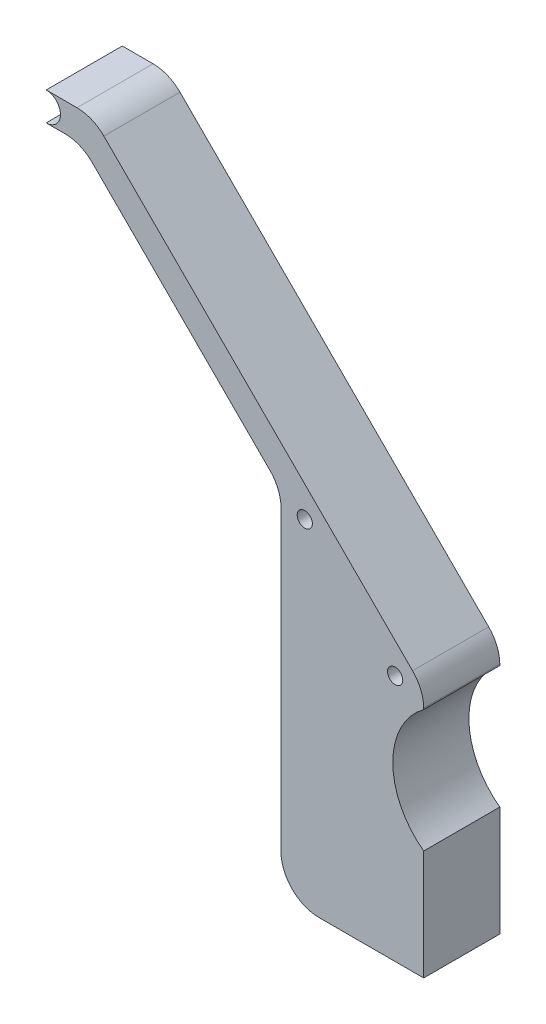
ISO-10303-21;
HEADER;
FILE_DESCRIPTION(('STEP AP214'),'2;1');
FILE_NAME('part.step','',(''),(''),'','','');
FILE_SCHEMA(('AUTOMOTIVE_DESIGN { 1 0 10303 214 1 1 1 1 }'));
ENDSEC;
DATA;
#1=APPLICATION_CONTEXT('core data for automotive mechanical design processes');
#2=APPLICATION_PROTOCOL_DEFINITION('international standard','automotive_design',2000,#1);
#3=PRODUCT_CONTEXT('',#1,'mechanical');
#4=PRODUCT('Part','Part','',(#3));
#5=PRODUCT_RELATED_PRODUCT_CATEGORY('part','',(#4));
#6=PRODUCT_DEFINITION_FORMATION('','',#4);
#7=PRODUCT_DEFINITION_CONTEXT('part definition',#1,'design');
#8=PRODUCT_DEFINITION('design','',#6,#7);
#9=PRODUCT_DEFINITION_SHAPE('','',#8);
#10=(LENGTH_UNIT() NAMED_UNIT(*) SI_UNIT(.MILLI.,.METRE.));
#11=(NAMED_UNIT(*) PLANE_ANGLE_UNIT() SI_UNIT($,.RADIAN.));
#12=(NAMED_UNIT(*) SI_UNIT($,.STERADIAN.) SOLID_ANGLE_UNIT());
#13=UNCERTAINTY_MEASURE_WITH_UNIT(LENGTH_MEASURE(1.E-05),#10,'distance_accuracy_value','');
#14=(GEOMETRIC_REPRESENTATION_CONTEXT(3) GLOBAL_UNCERTAINTY_ASSIGNED_CONTEXT((#13)) GLOBAL_UNIT_ASSIGNED_CONTEXT((#10,
#11,#12)) REPRESENTATION_CONTEXT('',''));
#15=CARTESIAN_POINT('',(0.,0.,0.));
#16=DIRECTION('',(0.,0.,1.));
#17=DIRECTION('',(1.,0.,0.));
#18=AXIS2_PLACEMENT_3D('',#15,#16,#17);
#19=CARTESIAN_POINT('',(0.0303342495161785,8.21230643760333,-8.));
#20=DIRECTION('',(1.,0.,0.));
#21=DIRECTION('',(0.,0.,-1.));
#22=AXIS2_PLACEMENT_3D('',#19,#20,#21);
#23=PLANE('',#22);
#24=DIRECTION('',(0.,0.,1.));
#25=VECTOR('',#24,1.);
#26=CARTESIAN_POINT('',(0.0303342495161819,6.43719659479187,-8.));
#27=LINE('',#26,#25);
#28=CARTESIAN_POINT('',(0.0303342495161819,6.43719659479187,-8.));
#29=VERTEX_POINT('',#28);
#30=CARTESIAN_POINT('',(0.0303342495161785,6.43719659479187,0.));
#31=VERTEX_POINT('',#30);
#32=EDGE_CURVE('E56',#29,#31,#27,.T.);
#33=ORIENTED_EDGE('',*,*,#32,.F.);
#34=DIRECTION('',(0.,1.,0.));
#35=VECTOR('',#34,1.);
#36=CARTESIAN_POINT('',(0.0303342495161785,8.21230643760333,-8.));
#37=LINE('',#36,#35);
#38=CARTESIAN_POINT('',(0.0303342495161785,6.55545218811096,-8.));
#39=VERTEX_POINT('',#38);
#40=EDGE_CURVE('E166',#29,#39,#37,.T.);
#41=ORIENTED_EDGE('',*,*,#40,.T.);
#42=DIRECTION('',(0.,0.,1.));
#43=VECTOR('',#42,1.);
#44=CARTESIAN_POINT('',(0.0303342495161785,6.55545218811096,-8.));
#45=LINE('',#44,#43);
#46=CARTESIAN_POINT('',(0.0303342495161785,6.55545218811096,0.));
#47=VERTEX_POINT('',#46);
#48=EDGE_CURVE('E262',#39,#47,#45,.T.);
#49=ORIENTED_EDGE('',*,*,#48,.T.);
#50=DIRECTION('',(0.,1.,0.));
#51=VECTOR('',#50,1.);
#52=CARTESIAN_POINT('',(0.0303342495161785,8.21230643760333,0.));
#53=LINE('',#52,#51);
#54=EDGE_CURVE('E207',#31,#47,#53,.T.);
#55=ORIENTED_EDGE('',*,*,#54,.F.);
#56=EDGE_LOOP('',(#33,#41,#49,#55));
#57=FACE_BOUND('',#56,.T.);
#58=ADVANCED_FACE('F40',(#57),#23,.T.);
#59=DIRECTION('',(0.,0.,1.));
#60=VECTOR('',#59,1.);
#61=CARTESIAN_POINT('',(0.0303342495161819,-6.43719659479187,-8.));
#62=LINE('',#61,#60);
#63=CARTESIAN_POINT('',(0.0303342495161819,-6.43719659479187,-8.));
#64=VERTEX_POINT('',#63);
#65=CARTESIAN_POINT('',(0.0303342495161819,-6.43719659479187,0.));
#66=VERTEX_POINT('',#65);
#67=EDGE_CURVE('E147',#64,#66,#62,.T.);
#68=ORIENTED_EDGE('',*,*,#67,.T.);
#69=CARTESIAN_POINT('',(0.0303342495161819,-18.0000000000001,0.));
#70=VERTEX_POINT('',#69);
#71=EDGE_CURVE('E203',#70,#66,#53,.T.);
#72=ORIENTED_EDGE('',*,*,#71,.F.);
#73=DIRECTION('',(0.,0.,1.));
#74=VECTOR('',#73,1.);
#75=CARTESIAN_POINT('',(0.0303342495161819,-18.0000000000001,-35.459060435492));
#76=LINE('',#75,#74);
#77=CARTESIAN_POINT('',(0.0303342495161819,-18.0000000000001,-8.));
#78=VERTEX_POINT('',#77);
#79=EDGE_CURVE('E171',#78,#70,#76,.T.);
#80=ORIENTED_EDGE('',*,*,#79,.F.);
#81=EDGE_CURVE('E163',#78,#64,#37,.T.);
#82=ORIENTED_EDGE('',*,*,#81,.T.);
#83=EDGE_LOOP('',(#68,#72,#80,#82));
#84=FACE_BOUND('',#83,.T.);
#85=ADVANCED_FACE('F169',(#84),#23,.T.);
#86=CARTESIAN_POINT('',(-14.9696657504838,4.99999999999992,-8.));
#87=DIRECTION('',(-1.,0.,0.));
#88=DIRECTION('',(0.,-1.,0.));
#89=AXIS2_PLACEMENT_3D('',#86,#87,#88);
#90=PLANE('',#89);
#91=DIRECTION('',(0.,-1.,0.));
#92=VECTOR('',#91,1.);
#93=CARTESIAN_POINT('',(-14.9696657504838,4.99999999999992,-8.));
#94=LINE('',#93,#92);
#95=CARTESIAN_POINT('',(-14.9696657504838,17.3128115009916,-8.));
#96=VERTEX_POINT('',#95);
#97=CARTESIAN_POINT('',(-14.9696657504838,-14.0000000000001,-8.));
#98=VERTEX_POINT('',#97);
#99=EDGE_CURVE('E198',#96,#98,#94,.T.);
#100=ORIENTED_EDGE('',*,*,#99,.T.);
#101=DIRECTION('',(0.,0.,1.));
#102=VECTOR('',#101,1.);
#103=CARTESIAN_POINT('',(-14.9696657504838,-14.0000000000001,-8.));
#104=LINE('',#103,#102);
#105=CARTESIAN_POINT('',(-14.9696657504838,-14.0000000000001,0.));
#106=VERTEX_POINT('',#105);
#107=EDGE_CURVE('E238',#98,#106,#104,.T.);
#108=ORIENTED_EDGE('',*,*,#107,.T.);
#109=DIRECTION('',(0.,-1.,0.));
#110=VECTOR('',#109,1.);
#111=CARTESIAN_POINT('',(-14.9696657504838,4.99999999999992,0.));
#112=LINE('',#111,#110);
#113=CARTESIAN_POINT('',(-14.9696657504838,17.3128115009916,0.));
#114=VERTEX_POINT('',#113);
#115=EDGE_CURVE('E179',#114,#106,#112,.T.);
#116=ORIENTED_EDGE('',*,*,#115,.F.);
#117=DIRECTION('',(0.,0.,1.));
#118=VECTOR('',#117,1.);
#119=CARTESIAN_POINT('',(-14.9696657504838,17.3128115009916,-8.));
#120=LINE('',#119,#118);
#121=EDGE_CURVE('E232',#114,#96,#120,.F.);
#122=ORIENTED_EDGE('',*,*,#121,.T.);
#123=EDGE_LOOP('',(#100,#108,#116,#122));
#124=FACE_BOUND('',#123,.T.);
#125=ADVANCED_FACE('F301',(#124),#90,.T.);
#126=CARTESIAN_POINT('',(-14.9696657504838,18.969665750484,-8.));
#127=DIRECTION('',(-0.707106781186546,-0.707106781186549,0.));
#128=DIRECTION('',(0.707106781186549,-0.707106781186546,0.));
#129=AXIS2_PLACEMENT_3D('',#126,#127,#128);
#130=PLANE('',#129);
#131=DIRECTION('',(0.707106781186549,-0.707106781186546,0.));
#132=VECTOR('',#131,1.);
#133=CARTESIAN_POINT('',(-14.9696657504838,18.969665750484,0.));
#134=LINE('',#133,#132);
#135=CARTESIAN_POINT('',(-34.8284271247461,38.8284271247461,0.));
#136=VERTEX_POINT('',#135);
#137=CARTESIAN_POINT('',(-16.1412386257376,20.1412386257378,0.));
#138=VERTEX_POINT('',#137);
#139=EDGE_CURVE('E222',#136,#138,#134,.T.);
#140=ORIENTED_EDGE('',*,*,#139,.F.);
#141=DIRECTION('',(0.,0.,1.));
#142=VECTOR('',#141,1.);
#143=CARTESIAN_POINT('',(-34.828427124746,38.8284271247461,-8.));
#144=LINE('',#143,#142);
#145=CARTESIAN_POINT('',(-34.8284271247461,38.8284271247461,-8.));
#146=VERTEX_POINT('',#145);
#147=EDGE_CURVE('E281',#136,#146,#144,.F.);
#148=ORIENTED_EDGE('',*,*,#147,.T.);
#149=DIRECTION('',(0.707106781186549,-0.707106781186546,0.));
#150=VECTOR('',#149,1.);
#151=CARTESIAN_POINT('',(-14.9696657504838,18.969665750484,-8.));
#152=LINE('',#151,#150);
#153=CARTESIAN_POINT('',(-16.1412386257376,20.1412386257378,-8.));
#154=VERTEX_POINT('',#153);
#155=EDGE_CURVE('E194',#146,#154,#152,.T.);
#156=ORIENTED_EDGE('',*,*,#155,.T.);
#157=DIRECTION('',(0.,0.,1.));
#158=VECTOR('',#157,1.);
#159=CARTESIAN_POINT('',(-16.1412386257376,20.1412386257378,0.));
#160=LINE('',#159,#158);
#161=EDGE_CURVE('E277',#154,#138,#160,.T.);
#162=ORIENTED_EDGE('',*,*,#161,.T.);
#163=EDGE_LOOP('',(#140,#148,#156,#162));
#164=FACE_BOUND('',#163,.T.);
#165=ADVANCED_FACE('F309',(#164),#130,.T.);
#166=CARTESIAN_POINT('',(-35.9999999999999,39.9999999999999,-8.));
#167=DIRECTION('',(0.,-1.,0.));
#168=DIRECTION('',(0.,0.,-1.));
#169=AXIS2_PLACEMENT_3D('',#166,#167,#168);
#170=PLANE('',#169);
#171=DIRECTION('',(1.,0.,0.));
#172=VECTOR('',#171,1.);
#173=CARTESIAN_POINT('',(-35.9999999999999,39.9999999999999,-8.));
#174=LINE('',#173,#172);
#175=CARTESIAN_POINT('',(-39.649665750484,39.9999999999999,-8.));
#176=VERTEX_POINT('',#175);
#177=CARTESIAN_POINT('',(-37.6568542494922,39.9999999999999,-8.));
#178=VERTEX_POINT('',#177);
#179=EDGE_CURVE('E190',#176,#178,#174,.T.);
#180=ORIENTED_EDGE('',*,*,#179,.T.);
#181=DIRECTION('',(0.,0.,1.));
#182=VECTOR('',#181,1.);
#183=CARTESIAN_POINT('',(-37.6568542494922,39.9999999999999,0.));
#184=LINE('',#183,#182);
#185=CARTESIAN_POINT('',(-37.6568542494922,39.9999999999999,0.));
#186=VERTEX_POINT('',#185);
#187=EDGE_CURVE('E273',#178,#186,#184,.T.);
#188=ORIENTED_EDGE('',*,*,#187,.T.);
#189=DIRECTION('',(1.,0.,0.));
#190=VECTOR('',#189,1.);
#191=CARTESIAN_POINT('',(-35.9999999999999,39.9999999999999,0.));
#192=LINE('',#191,#190);
#193=CARTESIAN_POINT('',(-39.649665750484,39.9999999999999,0.));
#194=VERTEX_POINT('',#193);
#195=EDGE_CURVE('E218',#194,#186,#192,.T.);
#196=ORIENTED_EDGE('',*,*,#195,.F.);
#197=DIRECTION('',(0.,0.,1.));
#198=VECTOR('',#197,1.);
#199=CARTESIAN_POINT('',(-39.649665750484,39.9999999999999,-8.));
#200=LINE('',#199,#198);
#201=EDGE_CURVE('E229',#176,#194,#200,.T.);
#202=ORIENTED_EDGE('',*,*,#201,.F.);
#203=EDGE_LOOP('',(#180,#188,#196,#202));
#204=FACE_BOUND('',#203,.T.);
#205=ADVANCED_FACE('F317',(#204),#170,.T.);
#206=CARTESIAN_POINT('',(-39.649665750484,41.5,-8.));
#207=DIRECTION('',(0.,0.,1.));
#208=DIRECTION('',(1.,0.,0.));
#209=AXIS2_PLACEMENT_3D('',#206,#207,#208);
#210=CYLINDRICAL_SURFACE('',#209,1.50000000000007);
#211=CARTESIAN_POINT('',(-39.649665750484,41.5,0.));
#212=DIRECTION('',(0.,0.,-1.));
#213=DIRECTION('',(-1.,0.,0.));
#214=AXIS2_PLACEMENT_3D('',#211,#212,#213);
#215=CIRCLE('',#214,1.50000000000007);
#216=CARTESIAN_POINT('',(-39.649665750484,43.0000000000001,0.));
#217=VERTEX_POINT('',#216);
#218=EDGE_CURVE('E214',#217,#194,#215,.T.);
#219=ORIENTED_EDGE('',*,*,#218,.F.);
#220=DIRECTION('',(0.,0.,1.));
#221=VECTOR('',#220,1.);
#222=CARTESIAN_POINT('',(-39.649665750484,43.0000000000001,-8.));
#223=LINE('',#222,#221);
#224=CARTESIAN_POINT('',(-39.649665750484,43.0000000000001,-8.));
#225=VERTEX_POINT('',#224);
#226=EDGE_CURVE('E202',#225,#217,#223,.T.);
#227=ORIENTED_EDGE('',*,*,#226,.F.);
#228=CARTESIAN_POINT('',(-39.649665750484,41.5,-8.));
#229=DIRECTION('',(0.,0.,-1.));
#230=DIRECTION('',(-1.,0.,0.));
#231=AXIS2_PLACEMENT_3D('',#228,#229,#230);
#232=CIRCLE('',#231,1.50000000000007);
#233=EDGE_CURVE('E186',#225,#176,#232,.T.);
#234=ORIENTED_EDGE('',*,*,#233,.T.);
#235=ORIENTED_EDGE('',*,*,#201,.T.);
#236=EDGE_LOOP('',(#219,#227,#234,#235));
#237=FACE_BOUND('',#236,.T.);
#238=ADVANCED_FACE('F321',(#237),#210,.F.);
#239=CARTESIAN_POINT('',(-34.7573593128807,43.0000000000001,-8.));
#240=DIRECTION('',(0.,1.,0.));
#241=DIRECTION('',(0.,0.,1.));
#242=AXIS2_PLACEMENT_3D('',#239,#240,#241);
#243=PLANE('',#242);
#244=DIRECTION('',(-1.,0.,0.));
#245=VECTOR('',#244,1.);
#246=CARTESIAN_POINT('',(-34.7573593128807,43.0000000000001,0.));
#247=LINE('',#246,#245);
#248=CARTESIAN_POINT('',(-36.4142135623731,43.0000000000001,0.));
#249=VERTEX_POINT('',#248);
#250=EDGE_CURVE('E211',#249,#217,#247,.T.);
#251=ORIENTED_EDGE('',*,*,#250,.F.);
#252=DIRECTION('',(0.,0.,1.));
#253=VECTOR('',#252,1.);
#254=CARTESIAN_POINT('',(-36.4142135623731,43.0000000000001,-8.));
#255=LINE('',#254,#253);
#256=CARTESIAN_POINT('',(-36.4142135623731,43.0000000000001,-8.));
#257=VERTEX_POINT('',#256);
#258=EDGE_CURVE('E284',#249,#257,#255,.F.);
#259=ORIENTED_EDGE('',*,*,#258,.T.);
#260=DIRECTION('',(-1.,0.,0.));
#261=VECTOR('',#260,1.);
#262=CARTESIAN_POINT('',(-34.7573593128807,43.0000000000001,-8.));
#263=LINE('',#262,#261);
#264=EDGE_CURVE('E177',#257,#225,#263,.T.);
#265=ORIENTED_EDGE('',*,*,#264,.T.);
#266=ORIENTED_EDGE('',*,*,#226,.T.);
#267=EDGE_LOOP('',(#251,#259,#265,#266));
#268=FACE_BOUND('',#267,.T.);
#269=ADVANCED_FACE('F497',(#268),#243,.T.);
#270=CARTESIAN_POINT('',(-34.7573593128807,43.0000000000001,-8.));
#271=DIRECTION('',(0.707106781186546,0.707106781186549,0.));
#272=DIRECTION('',(-0.707106781186549,0.707106781186546,0.));
#273=AXIS2_PLACEMENT_3D('',#270,#271,#272);
#274=PLANE('',#273);
#275=DIRECTION('',(-0.707106781186549,0.707106781186546,0.));
#276=VECTOR('',#275,1.);
#277=CARTESIAN_POINT('',(-34.7573593128807,43.0000000000001,0.));
#278=LINE('',#277,#276);
#279=CARTESIAN_POINT('',(-1.14123862573765,9.38387931285715,0.));
#280=VERTEX_POINT('',#279);
#281=CARTESIAN_POINT('',(-33.5857864376269,41.8284271247463,0.));
#282=VERTEX_POINT('',#281);
#283=EDGE_CURVE('E206',#280,#282,#278,.T.);
#284=ORIENTED_EDGE('',*,*,#283,.F.);
#285=DIRECTION('',(0.,0.,1.));
#286=VECTOR('',#285,1.);
#287=CARTESIAN_POINT('',(-1.14123862573765,9.38387931285715,-8.));
#288=LINE('',#287,#286);
#289=CARTESIAN_POINT('',(-1.14123862573765,9.38387931285715,-8.));
#290=VERTEX_POINT('',#289);
#291=EDGE_CURVE('E270',#280,#290,#288,.F.);
#292=ORIENTED_EDGE('',*,*,#291,.T.);
#293=DIRECTION('',(-0.707106781186549,0.707106781186546,0.));
#294=VECTOR('',#293,1.);
#295=CARTESIAN_POINT('',(-34.7573593128807,43.0000000000001,-8.));
#296=LINE('',#295,#294);
#297=CARTESIAN_POINT('',(-33.5857864376269,41.8284271247463,-8.));
#298=VERTEX_POINT('',#297);
#299=EDGE_CURVE('E173',#290,#298,#296,.T.);
#300=ORIENTED_EDGE('',*,*,#299,.T.);
#301=DIRECTION('',(0.,0.,1.));
#302=VECTOR('',#301,1.);
#303=CARTESIAN_POINT('',(-33.5857864376269,41.8284271247463,-8.));
#304=LINE('',#303,#302);
#305=EDGE_CURVE('E266',#298,#282,#304,.T.);
#306=ORIENTED_EDGE('',*,*,#305,.T.);
#307=EDGE_LOOP('',(#284,#292,#300,#306));
#308=FACE_BOUND('',#307,.T.);
#309=ADVANCED_FACE('F329',(#308),#274,.T.);
#310=CARTESIAN_POINT('',(-39.649665750484,41.5,-8.));
#311=DIRECTION('',(0.,0.,-1.));
#312=DIRECTION('',(-1.,0.,0.));
#313=AXIS2_PLACEMENT_3D('',#310,#311,#312);
#314=PLANE('',#313);
#315=CARTESIAN_POINT('',(4.78033424951618,0.,-8.));
#316=DIRECTION('',(0.,0.,1.));
#317=DIRECTION('',(1.,0.,0.));
#318=AXIS2_PLACEMENT_3D('',#315,#316,#317);
#319=CIRCLE('',#318,8.);
#320=EDGE_CURVE('E150',#29,#64,#319,.T.);
#321=ORIENTED_EDGE('',*,*,#320,.T.);
#322=ORIENTED_EDGE('',*,*,#81,.F.);
#323=DIRECTION('',(1.,0.,0.));
#324=VECTOR('',#323,1.);
#325=CARTESIAN_POINT('',(-14.9696657504838,-18.0000000000001,-8.));
#326=LINE('',#325,#324);
#327=CARTESIAN_POINT('',(-10.9696657504838,-18.0000000000001,-8.));
#328=VERTEX_POINT('',#327);
#329=EDGE_CURVE('E343',#328,#78,#326,.T.);
#330=ORIENTED_EDGE('',*,*,#329,.F.);
#331=CARTESIAN_POINT('',(-10.9696657504838,-14.0000000000001,-8.));
#332=DIRECTION('',(0.,0.,-1.));
#333=DIRECTION('',(-1.,0.,0.));
#334=AXIS2_PLACEMENT_3D('',#331,#332,#333);
#335=CIRCLE('',#334,4.);
#336=EDGE_CURVE('E259',#328,#98,#335,.T.);
#337=ORIENTED_EDGE('',*,*,#336,.T.);
#338=ORIENTED_EDGE('',*,*,#99,.F.);
#339=CARTESIAN_POINT('',(-18.9696657504838,17.3128115009916,-8.));
#340=DIRECTION('',(0.,0.,-1.));
#341=DIRECTION('',(-1.,0.,0.));
#342=AXIS2_PLACEMENT_3D('',#339,#340,#341);
#343=CIRCLE('',#342,4.);
#344=EDGE_CURVE('E11',#96,#154,#343,.F.);
#345=ORIENTED_EDGE('',*,*,#344,.T.);
#346=ORIENTED_EDGE('',*,*,#155,.F.);
#347=CARTESIAN_POINT('',(-37.6568542494922,35.9999999999999,-8.));
#348=DIRECTION('',(0.,0.,-1.));
#349=DIRECTION('',(-1.,0.,0.));
#350=AXIS2_PLACEMENT_3D('',#347,#348,#349);
#351=CIRCLE('',#350,4.);
#352=EDGE_CURVE('E290',#146,#178,#351,.F.);
#353=ORIENTED_EDGE('',*,*,#352,.T.);
#354=ORIENTED_EDGE('',*,*,#179,.F.);
#355=ORIENTED_EDGE('',*,*,#233,.F.);
#356=ORIENTED_EDGE('',*,*,#264,.F.);
#357=CARTESIAN_POINT('',(-36.4142135623731,39.0000000000001,-8.));
#358=DIRECTION('',(0.,0.,-1.));
#359=DIRECTION('',(-1.,0.,0.));
#360=AXIS2_PLACEMENT_3D('',#357,#358,#359);
#361=CIRCLE('',#360,4.);
#362=EDGE_CURVE('E64',#257,#298,#361,.T.);
#363=ORIENTED_EDGE('',*,*,#362,.T.);
#364=ORIENTED_EDGE('',*,*,#299,.F.);
#365=CARTESIAN_POINT('',(-3.96966575048382,6.55545218811096,-8.));
#366=DIRECTION('',(0.,0.,-1.));
#367=DIRECTION('',(-1.,0.,0.));
#368=AXIS2_PLACEMENT_3D('',#365,#366,#367);
#369=CIRCLE('',#368,4.);
#370=EDGE_CURVE('E256',#290,#39,#369,.T.);
#371=ORIENTED_EDGE('',*,*,#370,.T.);
#372=ORIENTED_EDGE('',*,*,#40,.F.);
#373=EDGE_LOOP('',(#321,#322,#330,#337,#338,#345,#346,#353,#354,#355,#356,#363,#364,#371,#372));
#374=FACE_BOUND('',#373,.T.);
#375=CARTESIAN_POINT('',(-2.96966575048382,7.99999999999992,-8.));
#376=DIRECTION('',(0.,0.,1.));
#377=DIRECTION('',(1.,0.,0.));
#378=AXIS2_PLACEMENT_3D('',#375,#376,#377);
#379=CIRCLE('',#378,0.799999999999998);
#380=CARTESIAN_POINT('',(-2.16966575048382,7.99999999999992,-8.));
#381=VERTEX_POINT('',#380);
#382=EDGE_CURVE('E355',#381,#381,#379,.T.);
#383=ORIENTED_EDGE('',*,*,#382,.T.);
#384=EDGE_LOOP('',(#383));
#385=FACE_BOUND('',#384,.T.);
#386=CARTESIAN_POINT('',(-12.4696657504838,17.4999999999999,-8.));
#387=DIRECTION('',(0.,0.,1.));
#388=DIRECTION('',(1.,0.,0.));
#389=AXIS2_PLACEMENT_3D('',#386,#387,#388);
#390=CIRCLE('',#389,0.799999999999999);
#391=CARTESIAN_POINT('',(-11.6696657504838,17.4999999999999,-8.));
#392=VERTEX_POINT('',#391);
#393=EDGE_CURVE('E181',#392,#392,#390,.T.);
#394=ORIENTED_EDGE('',*,*,#393,.T.);
#395=EDGE_LOOP('',(#394));
#396=FACE_BOUND('',#395,.T.);
#397=ADVANCED_FACE('F160',(#374,#385,#396),#314,.T.);
#398=CARTESIAN_POINT('',(-39.649665750484,41.5,0.));
#399=DIRECTION('',(0.,0.,-1.));
#400=DIRECTION('',(-1.,0.,0.));
#401=AXIS2_PLACEMENT_3D('',#398,#399,#400);
#402=PLANE('',#401);
#403=CARTESIAN_POINT('',(-2.96966575048382,7.99999999999992,0.));
#404=DIRECTION('',(0.,0.,1.));
#405=DIRECTION('',(1.,0.,0.));
#406=AXIS2_PLACEMENT_3D('',#403,#404,#405);
#407=CIRCLE('',#406,0.799999999999999);
#408=CARTESIAN_POINT('',(-2.16966575048382,7.99999999999992,0.));
#409=VERTEX_POINT('',#408);
#410=EDGE_CURVE('E351',#409,#409,#407,.T.);
#411=ORIENTED_EDGE('',*,*,#410,.F.);
#412=EDGE_LOOP('',(#411));
#413=FACE_BOUND('',#412,.T.);
#414=CARTESIAN_POINT('',(-12.4696657504838,17.4999999999999,0.));
#415=DIRECTION('',(0.,0.,1.));
#416=DIRECTION('',(1.,0.,0.));
#417=AXIS2_PLACEMENT_3D('',#414,#415,#416);
#418=CIRCLE('',#417,0.799999999999999);
#419=CARTESIAN_POINT('',(-11.6696657504838,17.4999999999999,0.));
#420=VERTEX_POINT('',#419);
#421=EDGE_CURVE('E358',#420,#420,#418,.T.);
#422=ORIENTED_EDGE('',*,*,#421,.F.);
#423=EDGE_LOOP('',(#422));
#424=FACE_BOUND('',#423,.T.);
#425=ORIENTED_EDGE('',*,*,#71,.T.);
#426=CARTESIAN_POINT('',(4.78033424951618,0.,0.));
#427=DIRECTION('',(0.,0.,1.));
#428=DIRECTION('',(1.,0.,0.));
#429=AXIS2_PLACEMENT_3D('',#426,#427,#428);
#430=CIRCLE('',#429,8.);
#431=EDGE_CURVE('E151',#31,#66,#430,.T.);
#432=ORIENTED_EDGE('',*,*,#431,.F.);
#433=ORIENTED_EDGE('',*,*,#54,.T.);
#434=CARTESIAN_POINT('',(-3.96966575048382,6.55545218811096,0.));
#435=DIRECTION('',(0.,0.,-1.));
#436=DIRECTION('',(-1.,0.,0.));
#437=AXIS2_PLACEMENT_3D('',#434,#435,#436);
#438=CIRCLE('',#437,4.);
#439=EDGE_CURVE('E245',#47,#280,#438,.F.);
#440=ORIENTED_EDGE('',*,*,#439,.T.);
#441=ORIENTED_EDGE('',*,*,#283,.T.);
#442=CARTESIAN_POINT('',(-36.4142135623731,39.0000000000001,0.));
#443=DIRECTION('',(0.,0.,-1.));
#444=DIRECTION('',(-1.,0.,0.));
#445=AXIS2_PLACEMENT_3D('',#442,#443,#444);
#446=CIRCLE('',#445,4.);
#447=EDGE_CURVE('E242',#282,#249,#446,.F.);
#448=ORIENTED_EDGE('',*,*,#447,.T.);
#449=ORIENTED_EDGE('',*,*,#250,.T.);
#450=ORIENTED_EDGE('',*,*,#218,.T.);
#451=ORIENTED_EDGE('',*,*,#195,.T.);
#452=CARTESIAN_POINT('',(-37.6568542494922,35.9999999999999,0.));
#453=DIRECTION('',(0.,0.,-1.));
#454=DIRECTION('',(-1.,0.,0.));
#455=AXIS2_PLACEMENT_3D('',#452,#453,#454);
#456=CIRCLE('',#455,4.);
#457=EDGE_CURVE('E287',#186,#136,#456,.T.);
#458=ORIENTED_EDGE('',*,*,#457,.T.);
#459=ORIENTED_EDGE('',*,*,#139,.T.);
#460=CARTESIAN_POINT('',(-18.9696657504838,17.3128115009916,0.));
#461=DIRECTION('',(0.,0.,-1.));
#462=DIRECTION('',(-1.,0.,0.));
#463=AXIS2_PLACEMENT_3D('',#460,#461,#462);
#464=CIRCLE('',#463,4.);
#465=EDGE_CURVE('E49',#138,#114,#464,.T.);
#466=ORIENTED_EDGE('',*,*,#465,.T.);
#467=ORIENTED_EDGE('',*,*,#115,.T.);
#468=CARTESIAN_POINT('',(-10.9696657504838,-14.0000000000001,0.));
#469=DIRECTION('',(0.,0.,-1.));
#470=DIRECTION('',(-1.,0.,0.));
#471=AXIS2_PLACEMENT_3D('',#468,#469,#470);
#472=CIRCLE('',#471,4.);
#473=CARTESIAN_POINT('',(-10.9696657504838,-18.0000000000001,0.));
#474=VERTEX_POINT('',#473);
#475=EDGE_CURVE('E248',#106,#474,#472,.F.);
#476=ORIENTED_EDGE('',*,*,#475,.T.);
#477=DIRECTION('',(1.,0.,0.));
#478=VECTOR('',#477,1.);
#479=CARTESIAN_POINT('',(-14.9696657504838,-18.0000000000001,0.));
#480=LINE('',#479,#478);
#481=EDGE_CURVE('E340',#474,#70,#480,.T.);
#482=ORIENTED_EDGE('',*,*,#481,.T.);
#483=EDGE_LOOP('',(#425,#432,#433,#440,#441,#448,#449,#450,#451,#458,#459,#466,#467,#476,#482));
#484=FACE_BOUND('',#483,.T.);
#485=ADVANCED_FACE('F295',(#413,#424,#484),#402,.F.);
#486=CARTESIAN_POINT('',(-12.4696657504838,17.4999999999999,0.));
#487=DIRECTION('',(0.,0.,1.));
#488=DIRECTION('',(1.,0.,0.));
#489=AXIS2_PLACEMENT_3D('',#486,#487,#488);
#490=CYLINDRICAL_SURFACE('',#489,0.799999999999999);
#491=ORIENTED_EDGE('',*,*,#393,.F.);
#492=EDGE_LOOP('',(#491));
#493=FACE_BOUND('',#492,.T.);
#494=ORIENTED_EDGE('',*,*,#421,.T.);
#495=EDGE_LOOP('',(#494));
#496=FACE_BOUND('',#495,.T.);
#497=ADVANCED_FACE('F369',(#493,#496),#490,.F.);
#498=CARTESIAN_POINT('',(-2.96966575048382,7.99999999999992,0.));
#499=DIRECTION('',(0.,0.,1.));
#500=DIRECTION('',(1.,0.,0.));
#501=AXIS2_PLACEMENT_3D('',#498,#499,#500);
#502=CYLINDRICAL_SURFACE('',#501,0.799999999999998);
#503=ORIENTED_EDGE('',*,*,#382,.F.);
#504=EDGE_LOOP('',(#503));
#505=FACE_BOUND('',#504,.T.);
#506=ORIENTED_EDGE('',*,*,#410,.T.);
#507=EDGE_LOOP('',(#506));
#508=FACE_BOUND('',#507,.T.);
#509=ADVANCED_FACE('F371',(#505,#508),#502,.F.);
#510=CARTESIAN_POINT('',(-14.9696657504838,-18.0000000000001,-35.459060435492));
#511=DIRECTION('',(0.,-1.,0.));
#512=DIRECTION('',(0.,0.,-1.));
#513=AXIS2_PLACEMENT_3D('',#510,#511,#512);
#514=PLANE('',#513);
#515=ORIENTED_EDGE('',*,*,#481,.F.);
#516=DIRECTION('',(0.,0.,1.));
#517=VECTOR('',#516,1.);
#518=CARTESIAN_POINT('',(-10.9696657504838,-18.0000000000001,-35.459060435492));
#519=LINE('',#518,#517);
#520=EDGE_CURVE('E251',#474,#328,#519,.F.);
#521=ORIENTED_EDGE('',*,*,#520,.T.);
#522=ORIENTED_EDGE('',*,*,#329,.T.);
#523=ORIENTED_EDGE('',*,*,#79,.T.);
#524=EDGE_LOOP('',(#515,#521,#522,#523));
#525=FACE_BOUND('',#524,.T.);
#526=ADVANCED_FACE('F377',(#525),#514,.T.);
#527=CARTESIAN_POINT('',(-10.9696657504838,-14.0000000000001,-8.));
#528=DIRECTION('',(0.,0.,1.));
#529=DIRECTION('',(1.,0.,0.));
#530=AXIS2_PLACEMENT_3D('',#527,#528,#529);
#531=CYLINDRICAL_SURFACE('',#530,4.);
#532=ORIENTED_EDGE('',*,*,#336,.F.);
#533=ORIENTED_EDGE('',*,*,#520,.F.);
#534=ORIENTED_EDGE('',*,*,#475,.F.);
#535=ORIENTED_EDGE('',*,*,#107,.F.);
#536=EDGE_LOOP('',(#532,#533,#534,#535));
#537=FACE_BOUND('',#536,.T.);
#538=ADVANCED_FACE('F393',(#537),#531,.T.);
#539=CARTESIAN_POINT('',(-3.96966575048382,6.55545218811096,-8.));
#540=DIRECTION('',(0.,0.,1.));
#541=DIRECTION('',(1.,0.,0.));
#542=AXIS2_PLACEMENT_3D('',#539,#540,#541);
#543=CYLINDRICAL_SURFACE('',#542,4.);
#544=ORIENTED_EDGE('',*,*,#370,.F.);
#545=ORIENTED_EDGE('',*,*,#291,.F.);
#546=ORIENTED_EDGE('',*,*,#439,.F.);
#547=ORIENTED_EDGE('',*,*,#48,.F.);
#548=EDGE_LOOP('',(#544,#545,#546,#547));
#549=FACE_BOUND('',#548,.T.);
#550=ADVANCED_FACE('F337',(#549),#543,.T.);
#551=CARTESIAN_POINT('',(-37.6568542494922,35.9999999999999,-8.));
#552=DIRECTION('',(0.,0.,-1.));
#553=DIRECTION('',(-1.,0.,0.));
#554=AXIS2_PLACEMENT_3D('',#551,#552,#553);
#555=CYLINDRICAL_SURFACE('',#554,4.);
#556=ORIENTED_EDGE('',*,*,#352,.F.);
#557=ORIENTED_EDGE('',*,*,#147,.F.);
#558=ORIENTED_EDGE('',*,*,#457,.F.);
#559=ORIENTED_EDGE('',*,*,#187,.F.);
#560=EDGE_LOOP('',(#556,#557,#558,#559));
#561=FACE_BOUND('',#560,.T.);
#562=ADVANCED_FACE('F312',(#561),#555,.F.);
#563=CARTESIAN_POINT('',(-18.9696657504838,17.3128115009916,-8.));
#564=DIRECTION('',(0.,0.,-1.));
#565=DIRECTION('',(-1.,0.,0.));
#566=AXIS2_PLACEMENT_3D('',#563,#564,#565);
#567=CYLINDRICAL_SURFACE('',#566,4.);
#568=ORIENTED_EDGE('',*,*,#344,.F.);
#569=ORIENTED_EDGE('',*,*,#121,.F.);
#570=ORIENTED_EDGE('',*,*,#465,.F.);
#571=ORIENTED_EDGE('',*,*,#161,.F.);
#572=EDGE_LOOP('',(#568,#569,#570,#571));
#573=FACE_BOUND('',#572,.T.);
#574=ADVANCED_FACE('F305',(#573),#567,.F.);
#575=CARTESIAN_POINT('',(-36.4142135623731,39.0000000000001,-8.));
#576=DIRECTION('',(0.,0.,1.));
#577=DIRECTION('',(1.,0.,0.));
#578=AXIS2_PLACEMENT_3D('',#575,#576,#577);
#579=CYLINDRICAL_SURFACE('',#578,4.);
#580=ORIENTED_EDGE('',*,*,#362,.F.);
#581=ORIENTED_EDGE('',*,*,#258,.F.);
#582=ORIENTED_EDGE('',*,*,#447,.F.);
#583=ORIENTED_EDGE('',*,*,#305,.F.);
#584=EDGE_LOOP('',(#580,#581,#582,#583));
#585=FACE_BOUND('',#584,.T.);
#586=ADVANCED_FACE('F42',(#585),#579,.T.);
#587=CARTESIAN_POINT('',(4.78033424951618,0.,-8.));
#588=DIRECTION('',(0.,0.,1.));
#589=DIRECTION('',(1.,0.,0.));
#590=AXIS2_PLACEMENT_3D('',#587,#588,#589);
#591=CYLINDRICAL_SURFACE('',#590,8.);
#592=ORIENTED_EDGE('',*,*,#431,.T.);
#593=ORIENTED_EDGE('',*,*,#67,.F.);
#594=ORIENTED_EDGE('',*,*,#320,.F.);
#595=ORIENTED_EDGE('',*,*,#32,.T.);
#596=EDGE_LOOP('',(#592,#593,#594,#595));
#597=FACE_BOUND('',#596,.T.);
#598=ADVANCED_FACE('F149',(#597),#591,.F.);
#599=CLOSED_SHELL('',(#58,#85,#125,#165,#205,#238,#269,#309,#397,#485,#497,#509,#526,#538,#550,
#562,#574,#586,#598));
#600=MANIFOLD_SOLID_BREP('B2',#599);
#601=ADVANCED_BREP_SHAPE_REPRESENTATION('',(#18,#600),#14);
#602=SHAPE_DEFINITION_REPRESENTATION(#9,#601);
ENDSEC;
END-ISO-10303-21;
